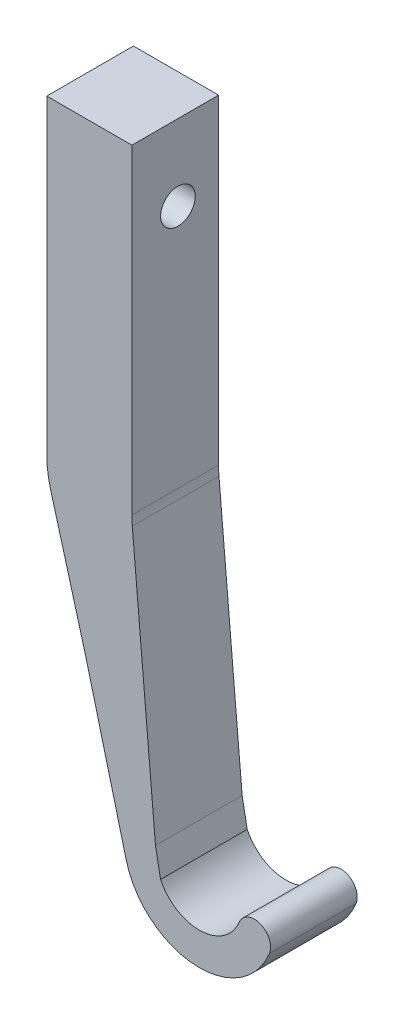
ISO-10303-21;
HEADER;
FILE_DESCRIPTION(('STEP AP214'),'2;1');
FILE_NAME('part.step','',(''),(''),'','','');
FILE_SCHEMA(('AUTOMOTIVE_DESIGN { 1 0 10303 214 1 1 1 1 }'));
ENDSEC;
DATA;
#1=APPLICATION_CONTEXT('core data for automotive mechanical design processes');
#2=APPLICATION_PROTOCOL_DEFINITION('international standard','automotive_design',2000,#1);
#3=PRODUCT_CONTEXT('',#1,'mechanical');
#4=PRODUCT('Part','Part','',(#3));
#5=PRODUCT_RELATED_PRODUCT_CATEGORY('part','',(#4));
#6=PRODUCT_DEFINITION_FORMATION('','',#4);
#7=PRODUCT_DEFINITION_CONTEXT('part definition',#1,'design');
#8=PRODUCT_DEFINITION('design','',#6,#7);
#9=PRODUCT_DEFINITION_SHAPE('','',#8);
#10=(LENGTH_UNIT() NAMED_UNIT(*) SI_UNIT(.MILLI.,.METRE.));
#11=(NAMED_UNIT(*) PLANE_ANGLE_UNIT() SI_UNIT($,.RADIAN.));
#12=(NAMED_UNIT(*) SI_UNIT($,.STERADIAN.) SOLID_ANGLE_UNIT());
#13=UNCERTAINTY_MEASURE_WITH_UNIT(LENGTH_MEASURE(1.E-05),#10,'distance_accuracy_value','');
#14=(GEOMETRIC_REPRESENTATION_CONTEXT(3) GLOBAL_UNCERTAINTY_ASSIGNED_CONTEXT((#13)) GLOBAL_UNIT_ASSIGNED_CONTEXT((#10,
#11,#12)) REPRESENTATION_CONTEXT('',''));
#15=CARTESIAN_POINT('',(0.,0.,0.));
#16=DIRECTION('',(0.,0.,1.));
#17=DIRECTION('',(1.,0.,0.));
#18=AXIS2_PLACEMENT_3D('',#15,#16,#17);
#19=CARTESIAN_POINT('',(0.,0.,4.));
#20=DIRECTION('',(0.,0.,-1.));
#21=DIRECTION('',(-1.,0.,0.));
#22=AXIS2_PLACEMENT_3D('',#19,#20,#21);
#23=CYLINDRICAL_SURFACE('',#22,3.96875);
#24=CARTESIAN_POINT('',(0.,0.,-4.));
#25=DIRECTION('',(0.,0.,1.));
#26=DIRECTION('',(1.,0.,0.));
#27=AXIS2_PLACEMENT_3D('',#24,#25,#26);
#28=CIRCLE('',#27,3.96875);
#29=CARTESIAN_POINT('',(-3.58437257752555,-1.7038925400338,-4.));
#30=VERTEX_POINT('',#29);
#31=CARTESIAN_POINT('',(3.67976092281195,-1.48671991761938,-4.));
#32=VERTEX_POINT('',#31);
#33=EDGE_CURVE('E187',#30,#32,#28,.T.);
#34=ORIENTED_EDGE('',*,*,#33,.F.);
#35=DIRECTION('',(0.,0.,-1.));
#36=VECTOR('',#35,1.);
#37=CARTESIAN_POINT('',(-3.58437257752555,-1.7038925400338,4.));
#38=LINE('',#37,#36);
#39=CARTESIAN_POINT('',(-3.58437257752555,-1.7038925400338,4.));
#40=VERTEX_POINT('',#39);
#41=EDGE_CURVE('E147',#40,#30,#38,.T.);
#42=ORIENTED_EDGE('',*,*,#41,.F.);
#43=CARTESIAN_POINT('',(0.,0.,4.));
#44=DIRECTION('',(0.,0.,1.));
#45=DIRECTION('',(1.,0.,0.));
#46=AXIS2_PLACEMENT_3D('',#43,#44,#45);
#47=CIRCLE('',#46,3.96875);
#48=CARTESIAN_POINT('',(3.67976092281195,-1.48671991761938,4.));
#49=VERTEX_POINT('',#48);
#50=EDGE_CURVE('E171',#40,#49,#47,.T.);
#51=ORIENTED_EDGE('',*,*,#50,.T.);
#52=DIRECTION('',(0.,0.,-1.));
#53=VECTOR('',#52,1.);
#54=CARTESIAN_POINT('',(3.67976092281195,-1.48671991761938,4.));
#55=LINE('',#54,#53);
#56=EDGE_CURVE('E206',#49,#32,#55,.T.);
#57=ORIENTED_EDGE('',*,*,#56,.T.);
#58=EDGE_LOOP('',(#34,#42,#51,#57));
#59=FACE_BOUND('',#58,.T.);
#60=ADVANCED_FACE('F39',(#59),#23,.F.);
#61=CARTESIAN_POINT('',(-3.95364770805162,-0.345899354029756,4.));
#62=DIRECTION('',(-0.996194698091746,-0.0871557427476549,0.));
#63=DIRECTION('',(0.0871557427476549,-0.996194698091746,0.));
#64=AXIS2_PLACEMENT_3D('',#61,#62,#63);
#65=PLANE('',#64);
#66=DIRECTION('',(-0.0871557427476549,0.996194698091746,0.));
#67=VECTOR('',#66,1.);
#68=CARTESIAN_POINT('',(-3.95364770805162,-0.345899354029756,-4.));
#69=LINE('',#68,#67);
#70=CARTESIAN_POINT('',(-4.05134889418333,0.770830313497558,-4.));
#71=VERTEX_POINT('',#70);
#72=CARTESIAN_POINT('',(-6.19095699198445,25.2266627787771,-4.));
#73=VERTEX_POINT('',#72);
#74=EDGE_CURVE('E189',#71,#73,#69,.T.);
#75=ORIENTED_EDGE('',*,*,#74,.T.);
#76=DIRECTION('',(0.,0.,-1.));
#77=VECTOR('',#76,1.);
#78=CARTESIAN_POINT('',(-6.19095699198445,25.226662778777,4.));
#79=LINE('',#78,#77);
#80=CARTESIAN_POINT('',(-6.19095699198445,25.2266627787771,4.));
#81=VERTEX_POINT('',#80);
#82=EDGE_CURVE('E54',#73,#81,#79,.F.);
#83=ORIENTED_EDGE('',*,*,#82,.T.);
#84=DIRECTION('',(-0.0871557427476549,0.996194698091746,0.));
#85=VECTOR('',#84,1.);
#86=CARTESIAN_POINT('',(-3.95364770805162,-0.345899354029756,4.));
#87=LINE('',#86,#85);
#88=CARTESIAN_POINT('',(-4.05134889418333,0.770830313497558,4.));
#89=VERTEX_POINT('',#88);
#90=EDGE_CURVE('E173',#89,#81,#87,.T.);
#91=ORIENTED_EDGE('',*,*,#90,.F.);
#92=DIRECTION('',(0.,0.,1.));
#93=VECTOR('',#92,1.);
#94=CARTESIAN_POINT('',(-4.05134889418333,0.770830313497545,4.));
#95=LINE('',#94,#93);
#96=EDGE_CURVE('E166',#71,#89,#95,.T.);
#97=ORIENTED_EDGE('',*,*,#96,.F.);
#98=EDGE_LOOP('',(#75,#83,#91,#97));
#99=FACE_BOUND('',#98,.T.);
#100=ADVANCED_FACE('F250',(#99),#65,.F.);
#101=CARTESIAN_POINT('',(-6.47106731338391,-1.79458579226475,4.));
#102=DIRECTION('',(0.963630453208622,0.267238376078261,0.));
#103=DIRECTION('',(-0.267238376078261,0.963630453208622,0.));
#104=AXIS2_PLACEMENT_3D('',#101,#102,#103);
#105=PLANE('',#104);
#106=DIRECTION('',(0.267238376078261,-0.963630453208622,0.));
#107=VECTOR('',#106,1.);
#108=CARTESIAN_POINT('',(-6.47106731338391,-1.79458579226475,4.));
#109=LINE('',#108,#107);
#110=CARTESIAN_POINT('',(-13.7216490407056,24.3501672872071,4.));
#111=VERTEX_POINT('',#110);
#112=CARTESIAN_POINT('',(-10.5270472543097,12.8308053885842,4.));
#113=VERTEX_POINT('',#112);
#114=EDGE_CURVE('E182',#111,#113,#109,.T.);
#115=ORIENTED_EDGE('',*,*,#114,.F.);
#116=DIRECTION('',(0.,0.,-1.));
#117=VECTOR('',#116,1.);
#118=CARTESIAN_POINT('',(-13.7216490407056,24.3501672872071,-4.));
#119=LINE('',#118,#117);
#120=CARTESIAN_POINT('',(-13.7216490407056,24.3501672872071,-4.));
#121=VERTEX_POINT('',#120);
#122=EDGE_CURVE('E209',#111,#121,#119,.T.);
#123=ORIENTED_EDGE('',*,*,#122,.T.);
#124=DIRECTION('',(0.267238376078261,-0.963630453208622,0.));
#125=VECTOR('',#124,1.);
#126=CARTESIAN_POINT('',(-6.47106731338391,-1.79458579226475,-4.));
#127=LINE('',#126,#125);
#128=CARTESIAN_POINT('',(-10.5270472543097,12.8308053885842,-4.));
#129=VERTEX_POINT('',#128);
#130=EDGE_CURVE('E137',#121,#129,#127,.T.);
#131=ORIENTED_EDGE('',*,*,#130,.T.);
#132=DIRECTION('',(0.,0.,-1.));
#133=VECTOR('',#132,1.);
#134=CARTESIAN_POINT('',(-10.5270472543097,12.8308053885842,4.));
#135=LINE('',#134,#133);
#136=EDGE_CURVE('E146',#113,#129,#135,.T.);
#137=ORIENTED_EDGE('',*,*,#136,.F.);
#138=EDGE_LOOP('',(#115,#123,#131,#137));
#139=FACE_BOUND('',#138,.T.);
#140=ADVANCED_FACE('F256',(#139),#105,.F.);
#141=CARTESIAN_POINT('',(0.,0.,4.));
#142=DIRECTION('',(0.,0.,-1.));
#143=DIRECTION('',(-1.,0.,0.));
#144=AXIS2_PLACEMENT_3D('',#141,#142,#143);
#145=CYLINDRICAL_SURFACE('',#144,6.96875);
#146=DIRECTION('',(0.,0.,-1.));
#147=VECTOR('',#146,1.);
#148=CARTESIAN_POINT('',(-6.75723514275751,-1.7038925400338,4.));
#149=LINE('',#148,#147);
#150=CARTESIAN_POINT('',(-6.75723514275751,-1.7038925400338,4.));
#151=VERTEX_POINT('',#150);
#152=CARTESIAN_POINT('',(-6.75723514275751,-1.7038925400338,-4.));
#153=VERTEX_POINT('',#152);
#154=EDGE_CURVE('E140',#151,#153,#149,.T.);
#155=ORIENTED_EDGE('',*,*,#154,.T.);
#156=CARTESIAN_POINT('',(0.,0.,-4.));
#157=DIRECTION('',(0.,0.,1.));
#158=DIRECTION('',(1.,0.,0.));
#159=AXIS2_PLACEMENT_3D('',#156,#157,#158);
#160=CIRCLE('',#159,6.96875);
#161=CARTESIAN_POINT('',(6.46131248651232,-2.6105396978671,-4.));
#162=VERTEX_POINT('',#161);
#163=EDGE_CURVE('E125',#153,#162,#160,.T.);
#164=ORIENTED_EDGE('',*,*,#163,.T.);
#165=DIRECTION('',(0.,0.,-1.));
#166=VECTOR('',#165,1.);
#167=CARTESIAN_POINT('',(6.46131248651232,-2.6105396978671,4.));
#168=LINE('',#167,#166);
#169=CARTESIAN_POINT('',(6.46131248651232,-2.6105396978671,4.));
#170=VERTEX_POINT('',#169);
#171=EDGE_CURVE('E185',#170,#162,#168,.T.);
#172=ORIENTED_EDGE('',*,*,#171,.F.);
#173=CARTESIAN_POINT('',(0.,0.,4.));
#174=DIRECTION('',(0.,0.,1.));
#175=DIRECTION('',(1.,0.,0.));
#176=AXIS2_PLACEMENT_3D('',#173,#174,#175);
#177=CIRCLE('',#176,6.96875);
#178=EDGE_CURVE('E142',#151,#170,#177,.T.);
#179=ORIENTED_EDGE('',*,*,#178,.F.);
#180=EDGE_LOOP('',(#155,#164,#172,#179));
#181=FACE_BOUND('',#180,.T.);
#182=ADVANCED_FACE('F141',(#181),#145,.T.);
#183=CARTESIAN_POINT('',(5.07053670466213,-2.04862980774324,4.));
#184=DIRECTION('',(0.,0.,-1.));
#185=DIRECTION('',(-1.,0.,0.));
#186=AXIS2_PLACEMENT_3D('',#183,#184,#185);
#187=CYLINDRICAL_SURFACE('',#186,1.5);
#188=CARTESIAN_POINT('',(5.07053670466213,-2.04862980774324,-4.));
#189=DIRECTION('',(0.,0.,1.));
#190=DIRECTION('',(1.,0.,0.));
#191=AXIS2_PLACEMENT_3D('',#188,#189,#190);
#192=CIRCLE('',#191,1.5);
#193=EDGE_CURVE('E132',#32,#162,#192,.F.);
#194=ORIENTED_EDGE('',*,*,#193,.F.);
#195=ORIENTED_EDGE('',*,*,#56,.F.);
#196=CARTESIAN_POINT('',(5.07053670466213,-2.04862980774324,4.));
#197=DIRECTION('',(0.,0.,1.));
#198=DIRECTION('',(1.,0.,0.));
#199=AXIS2_PLACEMENT_3D('',#196,#197,#198);
#200=CIRCLE('',#199,1.5);
#201=EDGE_CURVE('E136',#49,#170,#200,.F.);
#202=ORIENTED_EDGE('',*,*,#201,.T.);
#203=ORIENTED_EDGE('',*,*,#171,.T.);
#204=EDGE_LOOP('',(#194,#195,#202,#203));
#205=FACE_BOUND('',#204,.T.);
#206=ADVANCED_FACE('F260',(#205),#187,.T.);
#207=CARTESIAN_POINT('',(-6.229010011067,0.,4.));
#208=DIRECTION('',(-1.,0.,0.));
#209=DIRECTION('',(0.,-1.,0.));
#210=AXIS2_PLACEMENT_3D('',#207,#208,#209);
#211=PLANE('',#210);
#212=CARTESIAN_POINT('',(-6.229010011067,48.6616107771685,-0.24999999999926));
#213=DIRECTION('',(-1.,0.,0.));
#214=DIRECTION('',(0.,-1.,0.));
#215=AXIS2_PLACEMENT_3D('',#212,#213,#214);
#216=CIRCLE('',#215,1.6);
#217=CARTESIAN_POINT('',(-6.229010011067,47.0616107771685,-0.24999999999926));
#218=VERTEX_POINT('',#217);
#219=EDGE_CURVE('E159',#218,#218,#216,.T.);
#220=ORIENTED_EDGE('',*,*,#219,.T.);
#221=EDGE_LOOP('',(#220));
#222=FACE_BOUND('',#221,.T.);
#223=DIRECTION('',(0.,1.,0.));
#224=VECTOR('',#223,1.);
#225=CARTESIAN_POINT('',(-6.229010011067,0.,4.));
#226=LINE('',#225,#224);
#227=CARTESIAN_POINT('',(-6.229010011067,26.0982202062536,4.));
#228=VERTEX_POINT('',#227);
#229=CARTESIAN_POINT('',(-6.22901001106699,55.6616107771685,4.));
#230=VERTEX_POINT('',#229);
#231=EDGE_CURVE('E175',#228,#230,#226,.T.);
#232=ORIENTED_EDGE('',*,*,#231,.F.);
#233=DIRECTION('',(0.,0.,-1.));
#234=VECTOR('',#233,1.);
#235=CARTESIAN_POINT('',(-6.229010011067,26.0982202062536,-4.));
#236=LINE('',#235,#234);
#237=CARTESIAN_POINT('',(-6.229010011067,26.0982202062536,-4.));
#238=VERTEX_POINT('',#237);
#239=EDGE_CURVE('E218',#228,#238,#236,.T.);
#240=ORIENTED_EDGE('',*,*,#239,.T.);
#241=DIRECTION('',(0.,1.,0.));
#242=VECTOR('',#241,1.);
#243=CARTESIAN_POINT('',(-6.229010011067,0.,-4.));
#244=LINE('',#243,#242);
#245=CARTESIAN_POINT('',(-6.22901001106699,55.6616107771685,-4.));
#246=VERTEX_POINT('',#245);
#247=EDGE_CURVE('E191',#238,#246,#244,.T.);
#248=ORIENTED_EDGE('',*,*,#247,.T.);
#249=DIRECTION('',(0.,0.,-1.));
#250=VECTOR('',#249,1.);
#251=CARTESIAN_POINT('',(-6.22901001106699,55.6616107771685,4.));
#252=LINE('',#251,#250);
#253=EDGE_CURVE('E203',#230,#246,#252,.T.);
#254=ORIENTED_EDGE('',*,*,#253,.F.);
#255=EDGE_LOOP('',(#232,#240,#248,#254));
#256=FACE_BOUND('',#255,.T.);
#257=ADVANCED_FACE('F224',(#222,#256),#211,.F.);
#258=CARTESIAN_POINT('',(0.,55.6616107771685,4.));
#259=DIRECTION('',(0.,-1.,0.));
#260=DIRECTION('',(0.,0.,-1.));
#261=AXIS2_PLACEMENT_3D('',#258,#259,#260);
#262=PLANE('',#261);
#263=DIRECTION('',(-1.,0.,0.));
#264=VECTOR('',#263,1.);
#265=CARTESIAN_POINT('',(0.,55.6616107771685,-4.));
#266=LINE('',#265,#264);
#267=CARTESIAN_POINT('',(-14.0853445086194,55.6616107771685,-4.));
#268=VERTEX_POINT('',#267);
#269=EDGE_CURVE('E193',#246,#268,#266,.T.);
#270=ORIENTED_EDGE('',*,*,#269,.T.);
#271=DIRECTION('',(0.,0.,-1.));
#272=VECTOR('',#271,1.);
#273=CARTESIAN_POINT('',(-14.0853445086194,55.6616107771685,4.));
#274=LINE('',#273,#272);
#275=CARTESIAN_POINT('',(-14.0853445086194,55.6616107771685,4.));
#276=VERTEX_POINT('',#275);
#277=EDGE_CURVE('E200',#276,#268,#274,.T.);
#278=ORIENTED_EDGE('',*,*,#277,.F.);
#279=DIRECTION('',(-1.,0.,0.));
#280=VECTOR('',#279,1.);
#281=CARTESIAN_POINT('',(0.,55.6616107771685,4.));
#282=LINE('',#281,#280);
#283=EDGE_CURVE('E177',#230,#276,#282,.T.);
#284=ORIENTED_EDGE('',*,*,#283,.F.);
#285=ORIENTED_EDGE('',*,*,#253,.T.);
#286=EDGE_LOOP('',(#270,#278,#284,#285));
#287=FACE_BOUND('',#286,.T.);
#288=ADVANCED_FACE('F232',(#287),#262,.F.);
#289=CARTESIAN_POINT('',(-14.0853445086194,0.,4.));
#290=DIRECTION('',(-1.,0.,0.));
#291=DIRECTION('',(0.,-1.,0.));
#292=AXIS2_PLACEMENT_3D('',#289,#290,#291);
#293=PLANE('',#292);
#294=CARTESIAN_POINT('',(-14.0853445086194,48.6616107771685,-0.24999999999926));
#295=DIRECTION('',(-1.,0.,0.));
#296=DIRECTION('',(0.,-1.,0.));
#297=AXIS2_PLACEMENT_3D('',#294,#295,#296);
#298=CIRCLE('',#297,1.6);
#299=CARTESIAN_POINT('',(-14.0853445086194,47.0616107771685,-0.24999999999926));
#300=VERTEX_POINT('',#299);
#301=EDGE_CURVE('E277',#300,#300,#298,.T.);
#302=ORIENTED_EDGE('',*,*,#301,.F.);
#303=EDGE_LOOP('',(#302));
#304=FACE_BOUND('',#303,.T.);
#305=DIRECTION('',(0.,1.,0.));
#306=VECTOR('',#305,1.);
#307=CARTESIAN_POINT('',(-14.0853445086194,0.,-4.));
#308=LINE('',#307,#306);
#309=CARTESIAN_POINT('',(-14.0853445086194,27.0225510479898,-4.));
#310=VERTEX_POINT('',#309);
#311=EDGE_CURVE('E196',#310,#268,#308,.T.);
#312=ORIENTED_EDGE('',*,*,#311,.F.);
#313=DIRECTION('',(0.,0.,-1.));
#314=VECTOR('',#313,1.);
#315=CARTESIAN_POINT('',(-14.0853445086194,27.0225510479898,4.));
#316=LINE('',#315,#314);
#317=CARTESIAN_POINT('',(-14.0853445086194,27.0225510479898,4.));
#318=VERTEX_POINT('',#317);
#319=EDGE_CURVE('E214',#310,#318,#316,.F.);
#320=ORIENTED_EDGE('',*,*,#319,.T.);
#321=DIRECTION('',(0.,1.,0.));
#322=VECTOR('',#321,1.);
#323=CARTESIAN_POINT('',(-14.0853445086194,0.,4.));
#324=LINE('',#323,#322);
#325=EDGE_CURVE('E180',#318,#276,#324,.T.);
#326=ORIENTED_EDGE('',*,*,#325,.T.);
#327=ORIENTED_EDGE('',*,*,#277,.T.);
#328=EDGE_LOOP('',(#312,#320,#326,#327));
#329=FACE_BOUND('',#328,.T.);
#330=ADVANCED_FACE('F282',(#304,#329),#293,.T.);
#331=CARTESIAN_POINT('',(0.,0.,4.));
#332=DIRECTION('',(0.,0.,1.));
#333=DIRECTION('',(1.,0.,0.));
#334=AXIS2_PLACEMENT_3D('',#331,#332,#333);
#335=PLANE('',#334);
#336=ORIENTED_EDGE('',*,*,#325,.F.);
#337=CARTESIAN_POINT('',(-4.08534450861942,27.0225510479898,4.));
#338=DIRECTION('',(0.,0.,1.));
#339=DIRECTION('',(1.,0.,0.));
#340=AXIS2_PLACEMENT_3D('',#337,#338,#339);
#341=CIRCLE('',#340,10.);
#342=EDGE_CURVE('E216',#318,#111,#341,.T.);
#343=ORIENTED_EDGE('',*,*,#342,.T.);
#344=ORIENTED_EDGE('',*,*,#114,.T.);
#345=DIRECTION('',(0.251059324596826,-0.967971701824483,0.));
#346=VECTOR('',#345,1.);
#347=CARTESIAN_POINT('',(-10.5270472543097,12.8308053885842,4.));
#348=LINE('',#347,#346);
#349=EDGE_CURVE('E156',#113,#151,#348,.T.);
#350=ORIENTED_EDGE('',*,*,#349,.T.);
#351=ORIENTED_EDGE('',*,*,#178,.T.);
#352=ORIENTED_EDGE('',*,*,#201,.F.);
#353=ORIENTED_EDGE('',*,*,#50,.F.);
#354=DIRECTION('',(-0.185426062940012,0.982658218905519,0.));
#355=VECTOR('',#354,1.);
#356=CARTESIAN_POINT('',(-3.58437257752555,-1.7038925400338,4.));
#357=LINE('',#356,#355);
#358=EDGE_CURVE('E152',#40,#89,#357,.T.);
#359=ORIENTED_EDGE('',*,*,#358,.T.);
#360=ORIENTED_EDGE('',*,*,#90,.T.);
#361=CARTESIAN_POINT('',(3.77098998893301,26.0982202062536,4.));
#362=DIRECTION('',(0.,0.,1.));
#363=DIRECTION('',(1.,0.,0.));
#364=AXIS2_PLACEMENT_3D('',#361,#362,#363);
#365=CIRCLE('',#364,10.);
#366=EDGE_CURVE('E11',#81,#228,#365,.F.);
#367=ORIENTED_EDGE('',*,*,#366,.T.);
#368=ORIENTED_EDGE('',*,*,#231,.T.);
#369=ORIENTED_EDGE('',*,*,#283,.T.);
#370=EDGE_LOOP('',(#336,#343,#344,#350,#351,#352,#353,#359,#360,#367,#368,#369));
#371=FACE_BOUND('',#370,.T.);
#372=ADVANCED_FACE('F236',(#371),#335,.T.);
#373=CARTESIAN_POINT('',(0.,0.,-4.));
#374=DIRECTION('',(0.,0.,1.));
#375=DIRECTION('',(1.,0.,0.));
#376=AXIS2_PLACEMENT_3D('',#373,#374,#375);
#377=PLANE('',#376);
#378=ORIENTED_EDGE('',*,*,#130,.F.);
#379=CARTESIAN_POINT('',(-4.08534450861942,27.0225510479898,-4.));
#380=DIRECTION('',(0.,0.,1.));
#381=DIRECTION('',(1.,0.,0.));
#382=AXIS2_PLACEMENT_3D('',#379,#380,#381);
#383=CIRCLE('',#382,10.);
#384=EDGE_CURVE('E212',#121,#310,#383,.F.);
#385=ORIENTED_EDGE('',*,*,#384,.T.);
#386=ORIENTED_EDGE('',*,*,#311,.T.);
#387=ORIENTED_EDGE('',*,*,#269,.F.);
#388=ORIENTED_EDGE('',*,*,#247,.F.);
#389=CARTESIAN_POINT('',(3.77098998893301,26.0982202062536,-4.));
#390=DIRECTION('',(0.,0.,1.));
#391=DIRECTION('',(1.,0.,0.));
#392=AXIS2_PLACEMENT_3D('',#389,#390,#391);
#393=CIRCLE('',#392,10.);
#394=EDGE_CURVE('E47',#238,#73,#393,.T.);
#395=ORIENTED_EDGE('',*,*,#394,.T.);
#396=ORIENTED_EDGE('',*,*,#74,.F.);
#397=DIRECTION('',(-0.185426062940012,0.982658218905519,0.));
#398=VECTOR('',#397,1.);
#399=CARTESIAN_POINT('',(-3.58437257752555,-1.7038925400338,-4.));
#400=LINE('',#399,#398);
#401=EDGE_CURVE('E153',#30,#71,#400,.T.);
#402=ORIENTED_EDGE('',*,*,#401,.F.);
#403=ORIENTED_EDGE('',*,*,#33,.T.);
#404=ORIENTED_EDGE('',*,*,#193,.T.);
#405=ORIENTED_EDGE('',*,*,#163,.F.);
#406=DIRECTION('',(0.251059324596826,-0.967971701824483,0.));
#407=VECTOR('',#406,1.);
#408=CARTESIAN_POINT('',(-10.5270472543097,12.8308053885842,-4.));
#409=LINE('',#408,#407);
#410=EDGE_CURVE('E130',#129,#153,#409,.T.);
#411=ORIENTED_EDGE('',*,*,#410,.F.);
#412=EDGE_LOOP('',(#378,#385,#386,#387,#388,#395,#396,#402,#403,#404,#405,#411));
#413=FACE_BOUND('',#412,.T.);
#414=ADVANCED_FACE('F128',(#413),#377,.F.);
#415=CARTESIAN_POINT('',(-10.5270472543097,12.8308053885842,4.));
#416=DIRECTION('',(0.967971701824483,0.251059324596826,0.));
#417=DIRECTION('',(-0.251059324596826,0.967971701824483,0.));
#418=AXIS2_PLACEMENT_3D('',#415,#416,#417);
#419=PLANE('',#418);
#420=ORIENTED_EDGE('',*,*,#410,.T.);
#421=ORIENTED_EDGE('',*,*,#154,.F.);
#422=ORIENTED_EDGE('',*,*,#349,.F.);
#423=ORIENTED_EDGE('',*,*,#136,.T.);
#424=EDGE_LOOP('',(#420,#421,#422,#423));
#425=FACE_BOUND('',#424,.T.);
#426=ADVANCED_FACE('F150',(#425),#419,.F.);
#427=CARTESIAN_POINT('',(-3.58437257752555,-1.7038925400338,4.));
#428=DIRECTION('',(-0.982658218905519,-0.185426062940012,0.));
#429=DIRECTION('',(0.185426062940012,-0.982658218905519,0.));
#430=AXIS2_PLACEMENT_3D('',#427,#428,#429);
#431=PLANE('',#430);
#432=ORIENTED_EDGE('',*,*,#401,.T.);
#433=ORIENTED_EDGE('',*,*,#96,.T.);
#434=ORIENTED_EDGE('',*,*,#358,.F.);
#435=ORIENTED_EDGE('',*,*,#41,.T.);
#436=EDGE_LOOP('',(#432,#433,#434,#435));
#437=FACE_BOUND('',#436,.T.);
#438=ADVANCED_FACE('F247',(#437),#431,.F.);
#439=CARTESIAN_POINT('',(-4.08534450861942,27.0225510479898,4.));
#440=DIRECTION('',(0.,0.,1.));
#441=DIRECTION('',(1.,0.,0.));
#442=AXIS2_PLACEMENT_3D('',#439,#440,#441);
#443=CYLINDRICAL_SURFACE('',#442,10.);
#444=ORIENTED_EDGE('',*,*,#342,.F.);
#445=ORIENTED_EDGE('',*,*,#319,.F.);
#446=ORIENTED_EDGE('',*,*,#384,.F.);
#447=ORIENTED_EDGE('',*,*,#122,.F.);
#448=EDGE_LOOP('',(#444,#445,#446,#447));
#449=FACE_BOUND('',#448,.T.);
#450=ADVANCED_FACE('F240',(#449),#443,.T.);
#451=CARTESIAN_POINT('',(3.77098998893301,26.0982202062536,4.));
#452=DIRECTION('',(0.,0.,1.));
#453=DIRECTION('',(1.,0.,0.));
#454=AXIS2_PLACEMENT_3D('',#451,#452,#453);
#455=CYLINDRICAL_SURFACE('',#454,10.);
#456=ORIENTED_EDGE('',*,*,#366,.F.);
#457=ORIENTED_EDGE('',*,*,#82,.F.);
#458=ORIENTED_EDGE('',*,*,#394,.F.);
#459=ORIENTED_EDGE('',*,*,#239,.F.);
#460=EDGE_LOOP('',(#456,#457,#458,#459));
#461=FACE_BOUND('',#460,.T.);
#462=ADVANCED_FACE('F41',(#461),#455,.F.);
#463=CARTESIAN_POINT('',(7.41465549138058,48.6616107771685,-0.24999999999926));
#464=DIRECTION('',(-1.,0.,0.));
#465=DIRECTION('',(0.,-1.,0.));
#466=AXIS2_PLACEMENT_3D('',#463,#464,#465);
#467=CYLINDRICAL_SURFACE('',#466,1.6);
#468=ORIENTED_EDGE('',*,*,#301,.T.);
#469=EDGE_LOOP('',(#468));
#470=FACE_BOUND('',#469,.T.);
#471=ORIENTED_EDGE('',*,*,#219,.F.);
#472=EDGE_LOOP('',(#471));
#473=FACE_BOUND('',#472,.T.);
#474=ADVANCED_FACE('F239',(#470,#473),#467,.F.);
#475=CLOSED_SHELL('',(#60,#100,#140,#182,#206,#257,#288,#330,#372,#414,#426,#438,#450,#462,#474));
#476=MANIFOLD_SOLID_BREP('B2',#475);
#477=ADVANCED_BREP_SHAPE_REPRESENTATION('',(#18,#476),#14);
#478=SHAPE_DEFINITION_REPRESENTATION(#9,#477);
ENDSEC;
END-ISO-10303-21;
